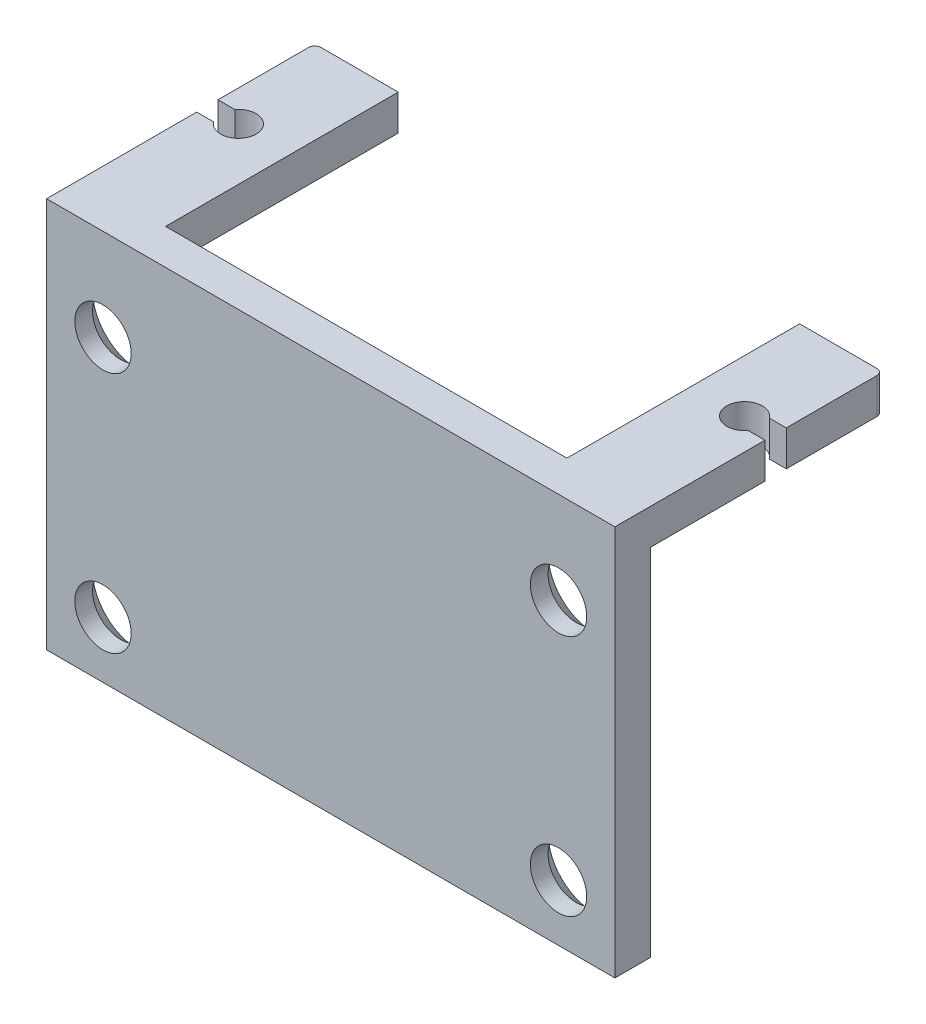
ISO-10303-21;
HEADER;
FILE_DESCRIPTION(('STEP AP214'),'2;1');
FILE_NAME('part.step','',(''),(''),'','','');
FILE_SCHEMA(('AUTOMOTIVE_DESIGN { 1 0 10303 214 1 1 1 1 }'));
ENDSEC;
DATA;
#1=APPLICATION_CONTEXT('core data for automotive mechanical design processes');
#2=APPLICATION_PROTOCOL_DEFINITION('international standard','automotive_design',2000,#1);
#3=PRODUCT_CONTEXT('',#1,'mechanical');
#4=PRODUCT('Part','Part','',(#3));
#5=PRODUCT_RELATED_PRODUCT_CATEGORY('part','',(#4));
#6=PRODUCT_DEFINITION_FORMATION('','',#4);
#7=PRODUCT_DEFINITION_CONTEXT('part definition',#1,'design');
#8=PRODUCT_DEFINITION('design','',#6,#7);
#9=PRODUCT_DEFINITION_SHAPE('','',#8);
#10=(LENGTH_UNIT() NAMED_UNIT(*) SI_UNIT(.MILLI.,.METRE.));
#11=(NAMED_UNIT(*) PLANE_ANGLE_UNIT() SI_UNIT($,.RADIAN.));
#12=(NAMED_UNIT(*) SI_UNIT($,.STERADIAN.) SOLID_ANGLE_UNIT());
#13=UNCERTAINTY_MEASURE_WITH_UNIT(LENGTH_MEASURE(1.E-05),#10,'distance_accuracy_value','');
#14=(GEOMETRIC_REPRESENTATION_CONTEXT(3) GLOBAL_UNCERTAINTY_ASSIGNED_CONTEXT((#13)) GLOBAL_UNIT_ASSIGNED_CONTEXT((#10,
#11,#12)) REPRESENTATION_CONTEXT('',''));
#15=CARTESIAN_POINT('',(0.,0.,0.));
#16=DIRECTION('',(0.,0.,1.));
#17=DIRECTION('',(1.,0.,0.));
#18=AXIS2_PLACEMENT_3D('',#15,#16,#17);
#19=CARTESIAN_POINT('',(-16.15,12.0772170092383,-0.6));
#20=DIRECTION('',(0.,0.,-1.));
#21=DIRECTION('',(-1.,0.,0.));
#22=AXIS2_PLACEMENT_3D('',#19,#20,#21);
#23=PLANE('',#22);
#24=DIRECTION('',(0.,-1.,0.));
#25=VECTOR('',#24,1.);
#26=CARTESIAN_POINT('',(-16.,20.2,-0.6));
#27=LINE('',#26,#25);
#28=CARTESIAN_POINT('',(-16.,20.2,-0.6));
#29=VERTEX_POINT('',#28);
#30=CARTESIAN_POINT('',(-16.,18.2,-0.6));
#31=VERTEX_POINT('',#30);
#32=EDGE_CURVE('E325',#29,#31,#27,.T.);
#33=ORIENTED_EDGE('',*,*,#32,.T.);
#34=DIRECTION('',(1.,0.,0.));
#35=VECTOR('',#34,1.);
#36=CARTESIAN_POINT('',(-16.15,18.2,-0.6));
#37=LINE('',#36,#35);
#38=CARTESIAN_POINT('',(-15.05,18.2,-0.6));
#39=VERTEX_POINT('',#38);
#40=EDGE_CURVE('E300',#31,#39,#37,.T.);
#41=ORIENTED_EDGE('',*,*,#40,.T.);
#42=DIRECTION('',(0.,1.,0.));
#43=VECTOR('',#42,1.);
#44=CARTESIAN_POINT('',(-15.05,12.0772170092383,-0.6));
#45=LINE('',#44,#43);
#46=CARTESIAN_POINT('',(-15.05,20.2,-0.6));
#47=VERTEX_POINT('',#46);
#48=EDGE_CURVE('E59',#39,#47,#45,.T.);
#49=ORIENTED_EDGE('',*,*,#48,.T.);
#50=DIRECTION('',(1.,0.,0.));
#51=VECTOR('',#50,1.);
#52=CARTESIAN_POINT('',(-16.,20.2,-0.6));
#53=LINE('',#52,#51);
#54=EDGE_CURVE('E323',#29,#47,#53,.T.);
#55=ORIENTED_EDGE('',*,*,#54,.F.);
#56=EDGE_LOOP('',(#33,#41,#49,#55));
#57=FACE_BOUND('',#56,.T.);
#58=ADVANCED_FACE('F43',(#57),#23,.F.);
#59=CARTESIAN_POINT('',(-14.25,12.0772170092383,0.));
#60=DIRECTION('',(0.,1.,0.));
#61=DIRECTION('',(0.,0.,1.));
#62=AXIS2_PLACEMENT_3D('',#59,#60,#61);
#63=CYLINDRICAL_SURFACE('',#62,1.);
#64=ORIENTED_EDGE('',*,*,#48,.F.);
#65=CARTESIAN_POINT('',(-14.25,18.2,0.));
#66=DIRECTION('',(0.,1.,0.));
#67=DIRECTION('',(0.,0.,1.));
#68=AXIS2_PLACEMENT_3D('',#65,#66,#67);
#69=CIRCLE('',#68,1.);
#70=CARTESIAN_POINT('',(-15.05,18.2,0.6));
#71=VERTEX_POINT('',#70);
#72=EDGE_CURVE('E302',#39,#71,#69,.F.);
#73=ORIENTED_EDGE('',*,*,#72,.T.);
#74=DIRECTION('',(0.,1.,0.));
#75=VECTOR('',#74,1.);
#76=CARTESIAN_POINT('',(-15.05,12.0772170092383,0.6));
#77=LINE('',#76,#75);
#78=CARTESIAN_POINT('',(-15.05,20.2,0.6));
#79=VERTEX_POINT('',#78);
#80=EDGE_CURVE('E340',#71,#79,#77,.T.);
#81=ORIENTED_EDGE('',*,*,#80,.T.);
#82=CARTESIAN_POINT('',(-14.25,20.2,0.));
#83=DIRECTION('',(0.,-1.,0.));
#84=DIRECTION('',(0.,0.,1.));
#85=AXIS2_PLACEMENT_3D('',#82,#83,#84);
#86=CIRCLE('',#85,1.);
#87=EDGE_CURVE('E308',#47,#79,#86,.T.);
#88=ORIENTED_EDGE('',*,*,#87,.F.);
#89=EDGE_LOOP('',(#64,#73,#81,#88));
#90=FACE_BOUND('',#89,.T.);
#91=ADVANCED_FACE('F397',(#90),#63,.F.);
#92=CARTESIAN_POINT('',(-16.15,12.0772170092383,0.6));
#93=DIRECTION('',(0.,0.,1.));
#94=DIRECTION('',(1.,0.,0.));
#95=AXIS2_PLACEMENT_3D('',#92,#93,#94);
#96=PLANE('',#95);
#97=ORIENTED_EDGE('',*,*,#80,.F.);
#98=DIRECTION('',(-1.,0.,0.));
#99=VECTOR('',#98,1.);
#100=CARTESIAN_POINT('',(-16.15,18.2,0.6));
#101=LINE('',#100,#99);
#102=CARTESIAN_POINT('',(-16.,18.2,0.6));
#103=VERTEX_POINT('',#102);
#104=EDGE_CURVE('E305',#71,#103,#101,.T.);
#105=ORIENTED_EDGE('',*,*,#104,.T.);
#106=DIRECTION('',(0.,-1.,0.));
#107=VECTOR('',#106,1.);
#108=CARTESIAN_POINT('',(-16.,20.2,0.6));
#109=LINE('',#108,#107);
#110=CARTESIAN_POINT('',(-16.,20.2,0.6));
#111=VERTEX_POINT('',#110);
#112=EDGE_CURVE('E337',#111,#103,#109,.T.);
#113=ORIENTED_EDGE('',*,*,#112,.F.);
#114=DIRECTION('',(-1.,0.,0.));
#115=VECTOR('',#114,1.);
#116=CARTESIAN_POINT('',(-15.05,20.2,0.6));
#117=LINE('',#116,#115);
#118=EDGE_CURVE('E311',#79,#111,#117,.T.);
#119=ORIENTED_EDGE('',*,*,#118,.F.);
#120=EDGE_LOOP('',(#97,#105,#113,#119));
#121=FACE_BOUND('',#120,.T.);
#122=ADVANCED_FACE('F402',(#121),#96,.F.);
#123=CARTESIAN_POINT('',(-11.3,16.6,-6.05));
#124=DIRECTION('',(-1.,0.,0.));
#125=DIRECTION('',(0.,0.,1.));
#126=AXIS2_PLACEMENT_3D('',#123,#124,#125);
#127=PLANE('',#126);
#128=DIRECTION('',(0.,0.,-1.));
#129=VECTOR('',#128,1.);
#130=CARTESIAN_POINT('',(-11.3,20.2,6.05));
#131=LINE('',#130,#129);
#132=CARTESIAN_POINT('',(-11.3,20.2,7.05));
#133=VERTEX_POINT('',#132);
#134=CARTESIAN_POINT('',(-11.3,20.2,-6.05));
#135=VERTEX_POINT('',#134);
#136=EDGE_CURVE('E315',#133,#135,#131,.T.);
#137=ORIENTED_EDGE('',*,*,#136,.F.);
#138=DIRECTION('',(0.,1.,0.));
#139=VECTOR('',#138,1.);
#140=CARTESIAN_POINT('',(-11.3,18.2,7.05));
#141=LINE('',#140,#139);
#142=CARTESIAN_POINT('',(-11.3,18.2,7.05));
#143=VERTEX_POINT('',#142);
#144=EDGE_CURVE('E214',#143,#133,#141,.T.);
#145=ORIENTED_EDGE('',*,*,#144,.F.);
#146=DIRECTION('',(0.,0.,-1.));
#147=VECTOR('',#146,1.);
#148=CARTESIAN_POINT('',(-11.3,18.2,-6.05));
#149=LINE('',#148,#147);
#150=CARTESIAN_POINT('',(-11.3,18.2,-6.05));
#151=VERTEX_POINT('',#150);
#152=EDGE_CURVE('E295',#143,#151,#149,.T.);
#153=ORIENTED_EDGE('',*,*,#152,.T.);
#154=DIRECTION('',(0.,-1.,0.));
#155=VECTOR('',#154,1.);
#156=CARTESIAN_POINT('',(-11.3,20.2,-6.05));
#157=LINE('',#156,#155);
#158=EDGE_CURVE('E334',#135,#151,#157,.T.);
#159=ORIENTED_EDGE('',*,*,#158,.F.);
#160=EDGE_LOOP('',(#137,#145,#153,#159));
#161=FACE_BOUND('',#160,.T.);
#162=ADVANCED_FACE('F406',(#161),#127,.F.);
#163=CARTESIAN_POINT('',(-16.,20.2,0.6));
#164=DIRECTION('',(1.,0.,0.));
#165=DIRECTION('',(0.,0.,-1.));
#166=AXIS2_PLACEMENT_3D('',#163,#164,#165);
#167=PLANE('',#166);
#168=DIRECTION('',(0.,0.,1.));
#169=VECTOR('',#168,1.);
#170=CARTESIAN_POINT('',(-16.,18.2,5.7));
#171=LINE('',#170,#169);
#172=CARTESIAN_POINT('',(-16.,18.2,7.05));
#173=VERTEX_POINT('',#172);
#174=EDGE_CURVE('E352',#103,#173,#171,.T.);
#175=ORIENTED_EDGE('',*,*,#174,.T.);
#176=DIRECTION('',(0.,1.,0.));
#177=VECTOR('',#176,1.);
#178=CARTESIAN_POINT('',(-16.,-1.8,7.05));
#179=LINE('',#178,#177);
#180=CARTESIAN_POINT('',(-16.,-1.8,7.05));
#181=VERTEX_POINT('',#180);
#182=EDGE_CURVE('E208',#181,#173,#179,.T.);
#183=ORIENTED_EDGE('',*,*,#182,.F.);
#184=DIRECTION('',(0.,0.,1.));
#185=VECTOR('',#184,1.);
#186=CARTESIAN_POINT('',(-16.,-1.8,6.05));
#187=LINE('',#186,#185);
#188=CARTESIAN_POINT('',(-16.,-1.8,9.05));
#189=VERTEX_POINT('',#188);
#190=EDGE_CURVE('E280',#181,#189,#187,.T.);
#191=ORIENTED_EDGE('',*,*,#190,.T.);
#192=DIRECTION('',(0.,1.,0.));
#193=VECTOR('',#192,1.);
#194=CARTESIAN_POINT('',(-16.,-1.8,9.05));
#195=LINE('',#194,#193);
#196=CARTESIAN_POINT('',(-16.,20.2,9.05));
#197=VERTEX_POINT('',#196);
#198=EDGE_CURVE('E289',#189,#197,#195,.T.);
#199=ORIENTED_EDGE('',*,*,#198,.T.);
#200=DIRECTION('',(0.,0.,1.));
#201=VECTOR('',#200,1.);
#202=CARTESIAN_POINT('',(-16.,20.2,0.6));
#203=LINE('',#202,#201);
#204=EDGE_CURVE('E313',#111,#197,#203,.T.);
#205=ORIENTED_EDGE('',*,*,#204,.F.);
#206=ORIENTED_EDGE('',*,*,#112,.T.);
#207=EDGE_LOOP('',(#175,#183,#191,#199,#205,#206));
#208=FACE_BOUND('',#207,.T.);
#209=ADVANCED_FACE('F451',(#208),#167,.F.);
#210=CARTESIAN_POINT('',(-11.3,20.2,-6.05));
#211=DIRECTION('',(0.,0.,1.));
#212=DIRECTION('',(1.,0.,0.));
#213=AXIS2_PLACEMENT_3D('',#210,#211,#212);
#214=PLANE('',#213);
#215=DIRECTION('',(-1.,0.,0.));
#216=VECTOR('',#215,1.);
#217=CARTESIAN_POINT('',(-15.65,18.2,-6.05));
#218=LINE('',#217,#216);
#219=CARTESIAN_POINT('',(-15.65,18.2,-6.05));
#220=VERTEX_POINT('',#219);
#221=EDGE_CURVE('E342',#151,#220,#218,.T.);
#222=ORIENTED_EDGE('',*,*,#221,.T.);
#223=DIRECTION('',(0.,-1.,0.));
#224=VECTOR('',#223,1.);
#225=CARTESIAN_POINT('',(-15.65,20.2,-6.05));
#226=LINE('',#225,#224);
#227=CARTESIAN_POINT('',(-15.65,20.2,-6.05));
#228=VERTEX_POINT('',#227);
#229=EDGE_CURVE('E331',#228,#220,#226,.T.);
#230=ORIENTED_EDGE('',*,*,#229,.F.);
#231=DIRECTION('',(-1.,0.,0.));
#232=VECTOR('',#231,1.);
#233=CARTESIAN_POINT('',(-11.3,20.2,-6.05));
#234=LINE('',#233,#232);
#235=EDGE_CURVE('E317',#135,#228,#234,.T.);
#236=ORIENTED_EDGE('',*,*,#235,.F.);
#237=ORIENTED_EDGE('',*,*,#158,.T.);
#238=EDGE_LOOP('',(#222,#230,#236,#237));
#239=FACE_BOUND('',#238,.T.);
#240=ADVANCED_FACE('F487',(#239),#214,.F.);
#241=CARTESIAN_POINT('',(-15.65,20.2,-5.7));
#242=DIRECTION('',(0.,-1.,0.));
#243=DIRECTION('',(0.,0.,-1.));
#244=AXIS2_PLACEMENT_3D('',#241,#242,#243);
#245=CYLINDRICAL_SURFACE('',#244,0.35);
#246=CARTESIAN_POINT('',(-15.65,18.2,-5.7));
#247=DIRECTION('',(0.,1.,0.));
#248=DIRECTION('',(0.,0.,1.));
#249=AXIS2_PLACEMENT_3D('',#246,#247,#248);
#250=CIRCLE('',#249,0.35);
#251=CARTESIAN_POINT('',(-16.,18.2,-5.7));
#252=VERTEX_POINT('',#251);
#253=EDGE_CURVE('E346',#220,#252,#250,.T.);
#254=ORIENTED_EDGE('',*,*,#253,.T.);
#255=DIRECTION('',(0.,-1.,0.));
#256=VECTOR('',#255,1.);
#257=CARTESIAN_POINT('',(-16.,20.2,-5.7));
#258=LINE('',#257,#256);
#259=CARTESIAN_POINT('',(-16.,20.2,-5.7));
#260=VERTEX_POINT('',#259);
#261=EDGE_CURVE('E328',#260,#252,#258,.T.);
#262=ORIENTED_EDGE('',*,*,#261,.F.);
#263=CARTESIAN_POINT('',(-15.65,20.2,-5.7));
#264=DIRECTION('',(0.,1.,0.));
#265=DIRECTION('',(0.,0.,1.));
#266=AXIS2_PLACEMENT_3D('',#263,#264,#265);
#267=CIRCLE('',#266,0.35);
#268=EDGE_CURVE('E319',#228,#260,#267,.T.);
#269=ORIENTED_EDGE('',*,*,#268,.F.);
#270=ORIENTED_EDGE('',*,*,#229,.T.);
#271=EDGE_LOOP('',(#254,#262,#269,#270));
#272=FACE_BOUND('',#271,.T.);
#273=ADVANCED_FACE('F491',(#272),#245,.T.);
#274=CARTESIAN_POINT('',(-16.,20.2,-5.7));
#275=DIRECTION('',(1.,0.,0.));
#276=DIRECTION('',(0.,0.,-1.));
#277=AXIS2_PLACEMENT_3D('',#274,#275,#276);
#278=PLANE('',#277);
#279=DIRECTION('',(0.,0.,1.));
#280=VECTOR('',#279,1.);
#281=CARTESIAN_POINT('',(-16.,18.2,-0.6));
#282=LINE('',#281,#280);
#283=EDGE_CURVE('E349',#252,#31,#282,.T.);
#284=ORIENTED_EDGE('',*,*,#283,.T.);
#285=ORIENTED_EDGE('',*,*,#32,.F.);
#286=DIRECTION('',(0.,0.,1.));
#287=VECTOR('',#286,1.);
#288=CARTESIAN_POINT('',(-16.,20.2,-5.7));
#289=LINE('',#288,#287);
#290=EDGE_CURVE('E321',#260,#29,#289,.T.);
#291=ORIENTED_EDGE('',*,*,#290,.F.);
#292=ORIENTED_EDGE('',*,*,#261,.T.);
#293=EDGE_LOOP('',(#284,#285,#291,#292));
#294=FACE_BOUND('',#293,.T.);
#295=ADVANCED_FACE('F496',(#294),#278,.F.);
#296=CARTESIAN_POINT('',(-14.25,20.2,0.));
#297=DIRECTION('',(0.,1.,0.));
#298=DIRECTION('',(0.,0.,1.));
#299=AXIS2_PLACEMENT_3D('',#296,#297,#298);
#300=PLANE('',#299);
#301=DIRECTION('',(0.,0.,1.));
#302=VECTOR('',#301,1.);
#303=CARTESIAN_POINT('',(11.3,20.2,-6.05));
#304=LINE('',#303,#302);
#305=CARTESIAN_POINT('',(11.3,20.2,-6.05));
#306=VERTEX_POINT('',#305);
#307=CARTESIAN_POINT('',(11.3,20.2,7.05));
#308=VERTEX_POINT('',#307);
#309=EDGE_CURVE('E239',#306,#308,#304,.T.);
#310=ORIENTED_EDGE('',*,*,#309,.T.);
#311=DIRECTION('',(1.,0.,0.));
#312=VECTOR('',#311,1.);
#313=CARTESIAN_POINT('',(-11.3,20.2,7.05));
#314=LINE('',#313,#312);
#315=EDGE_CURVE('E202',#133,#308,#314,.T.);
#316=ORIENTED_EDGE('',*,*,#315,.F.);
#317=ORIENTED_EDGE('',*,*,#136,.T.);
#318=ORIENTED_EDGE('',*,*,#235,.T.);
#319=ORIENTED_EDGE('',*,*,#268,.T.);
#320=ORIENTED_EDGE('',*,*,#290,.T.);
#321=ORIENTED_EDGE('',*,*,#54,.T.);
#322=ORIENTED_EDGE('',*,*,#87,.T.);
#323=ORIENTED_EDGE('',*,*,#118,.T.);
#324=ORIENTED_EDGE('',*,*,#204,.T.);
#325=DIRECTION('',(1.,0.,0.));
#326=VECTOR('',#325,1.);
#327=CARTESIAN_POINT('',(-16.,20.2,9.05));
#328=LINE('',#327,#326);
#329=CARTESIAN_POINT('',(16.,20.2,9.05));
#330=VERTEX_POINT('',#329);
#331=EDGE_CURVE('E277',#197,#330,#328,.T.);
#332=ORIENTED_EDGE('',*,*,#331,.T.);
#333=DIRECTION('',(0.,0.,-1.));
#334=VECTOR('',#333,1.);
#335=CARTESIAN_POINT('',(16.,20.2,6.05));
#336=LINE('',#335,#334);
#337=CARTESIAN_POINT('',(16.,20.2,0.599999999999996));
#338=VERTEX_POINT('',#337);
#339=EDGE_CURVE('E283',#330,#338,#336,.T.);
#340=ORIENTED_EDGE('',*,*,#339,.T.);
#341=DIRECTION('',(-1.,0.,0.));
#342=VECTOR('',#341,1.);
#343=CARTESIAN_POINT('',(16.,20.2,0.599999999999996));
#344=LINE('',#343,#342);
#345=CARTESIAN_POINT('',(15.05,20.2,0.599999999999995));
#346=VERTEX_POINT('',#345);
#347=EDGE_CURVE('E241',#338,#346,#344,.T.);
#348=ORIENTED_EDGE('',*,*,#347,.T.);
#349=CARTESIAN_POINT('',(14.25,20.2,0.));
#350=DIRECTION('',(0.,-1.,0.));
#351=DIRECTION('',(0.,0.,1.));
#352=AXIS2_PLACEMENT_3D('',#349,#350,#351);
#353=CIRCLE('',#352,0.999999999999997);
#354=CARTESIAN_POINT('',(15.05,20.2,-0.599999999999998));
#355=VERTEX_POINT('',#354);
#356=EDGE_CURVE('E244',#346,#355,#353,.T.);
#357=ORIENTED_EDGE('',*,*,#356,.T.);
#358=DIRECTION('',(1.,0.,0.));
#359=VECTOR('',#358,1.);
#360=CARTESIAN_POINT('',(15.05,20.2,-0.599999999999997));
#361=LINE('',#360,#359);
#362=CARTESIAN_POINT('',(16.,20.2,-0.599999999999996));
#363=VERTEX_POINT('',#362);
#364=EDGE_CURVE('E247',#355,#363,#361,.T.);
#365=ORIENTED_EDGE('',*,*,#364,.T.);
#366=DIRECTION('',(0.,0.,-1.));
#367=VECTOR('',#366,1.);
#368=CARTESIAN_POINT('',(16.,20.2,-0.599999999999996));
#369=LINE('',#368,#367);
#370=CARTESIAN_POINT('',(16.,20.2,-5.7));
#371=VERTEX_POINT('',#370);
#372=EDGE_CURVE('E249',#363,#371,#369,.T.);
#373=ORIENTED_EDGE('',*,*,#372,.T.);
#374=CARTESIAN_POINT('',(15.65,20.2,-5.7));
#375=DIRECTION('',(0.,1.,0.));
#376=DIRECTION('',(0.,0.,1.));
#377=AXIS2_PLACEMENT_3D('',#374,#375,#376);
#378=CIRCLE('',#377,0.35);
#379=CARTESIAN_POINT('',(15.65,20.2,-6.05));
#380=VERTEX_POINT('',#379);
#381=EDGE_CURVE('E251',#371,#380,#378,.T.);
#382=ORIENTED_EDGE('',*,*,#381,.T.);
#383=DIRECTION('',(-1.,0.,0.));
#384=VECTOR('',#383,1.);
#385=CARTESIAN_POINT('',(15.65,20.2,-6.05));
#386=LINE('',#385,#384);
#387=EDGE_CURVE('E236',#380,#306,#386,.T.);
#388=ORIENTED_EDGE('',*,*,#387,.T.);
#389=EDGE_LOOP('',(#310,#316,#317,#318,#319,#320,#321,#322,#323,#324,#332,#340,#348,#357,#365,
#373,#382,#388));
#390=FACE_BOUND('',#389,.T.);
#391=ADVANCED_FACE('F445',(#390),#300,.T.);
#392=CARTESIAN_POINT('',(0.,18.2,0.));
#393=DIRECTION('',(0.,1.,0.));
#394=DIRECTION('',(0.,0.,1.));
#395=AXIS2_PLACEMENT_3D('',#392,#393,#394);
#396=PLANE('',#395);
#397=ORIENTED_EDGE('',*,*,#152,.F.);
#398=DIRECTION('',(1.,0.,0.));
#399=VECTOR('',#398,1.);
#400=CARTESIAN_POINT('',(-16.,18.2,7.05));
#401=LINE('',#400,#399);
#402=EDGE_CURVE('E211',#173,#143,#401,.T.);
#403=ORIENTED_EDGE('',*,*,#402,.F.);
#404=ORIENTED_EDGE('',*,*,#174,.F.);
#405=ORIENTED_EDGE('',*,*,#104,.F.);
#406=ORIENTED_EDGE('',*,*,#72,.F.);
#407=ORIENTED_EDGE('',*,*,#40,.F.);
#408=ORIENTED_EDGE('',*,*,#283,.F.);
#409=ORIENTED_EDGE('',*,*,#253,.F.);
#410=ORIENTED_EDGE('',*,*,#221,.F.);
#411=EDGE_LOOP('',(#397,#403,#404,#405,#406,#407,#408,#409,#410));
#412=FACE_BOUND('',#411,.T.);
#413=ADVANCED_FACE('F499',(#412),#396,.F.);
#414=CARTESIAN_POINT('',(16.,-1.8,6.05));
#415=DIRECTION('',(1.,0.,0.));
#416=DIRECTION('',(0.,0.,-1.));
#417=AXIS2_PLACEMENT_3D('',#414,#415,#416);
#418=PLANE('',#417);
#419=DIRECTION('',(0.,-1.,0.));
#420=VECTOR('',#419,1.);
#421=CARTESIAN_POINT('',(16.,18.2,7.05));
#422=LINE('',#421,#420);
#423=CARTESIAN_POINT('',(16.,18.2,7.05));
#424=VERTEX_POINT('',#423);
#425=CARTESIAN_POINT('',(16.,-1.8,7.05));
#426=VERTEX_POINT('',#425);
#427=EDGE_CURVE('E197',#424,#426,#422,.T.);
#428=ORIENTED_EDGE('',*,*,#427,.F.);
#429=DIRECTION('',(0.,0.,-1.));
#430=VECTOR('',#429,1.);
#431=CARTESIAN_POINT('',(16.,18.2,0.599999999999996));
#432=LINE('',#431,#430);
#433=CARTESIAN_POINT('',(16.,18.2,0.599999999999996));
#434=VERTEX_POINT('',#433);
#435=EDGE_CURVE('E194',#424,#434,#432,.T.);
#436=ORIENTED_EDGE('',*,*,#435,.T.);
#437=DIRECTION('',(0.,-1.,0.));
#438=VECTOR('',#437,1.);
#439=CARTESIAN_POINT('',(16.,20.2,0.599999999999996));
#440=LINE('',#439,#438);
#441=EDGE_CURVE('E262',#338,#434,#440,.T.);
#442=ORIENTED_EDGE('',*,*,#441,.F.);
#443=ORIENTED_EDGE('',*,*,#339,.F.);
#444=DIRECTION('',(0.,1.,0.));
#445=VECTOR('',#444,1.);
#446=CARTESIAN_POINT('',(16.,-1.8,9.05));
#447=LINE('',#446,#445);
#448=CARTESIAN_POINT('',(16.,-1.8,9.05));
#449=VERTEX_POINT('',#448);
#450=EDGE_CURVE('E293',#449,#330,#447,.T.);
#451=ORIENTED_EDGE('',*,*,#450,.F.);
#452=DIRECTION('',(0.,0.,-1.));
#453=VECTOR('',#452,1.);
#454=CARTESIAN_POINT('',(16.,-1.8,6.05));
#455=LINE('',#454,#453);
#456=EDGE_CURVE('E286',#449,#426,#455,.T.);
#457=ORIENTED_EDGE('',*,*,#456,.T.);
#458=EDGE_LOOP('',(#428,#436,#442,#443,#451,#457));
#459=FACE_BOUND('',#458,.T.);
#460=ADVANCED_FACE('F435',(#459),#418,.T.);
#461=CARTESIAN_POINT('',(-16.,-1.8,9.05));
#462=DIRECTION('',(0.,0.,1.));
#463=DIRECTION('',(1.,0.,0.));
#464=AXIS2_PLACEMENT_3D('',#461,#462,#463);
#465=PLANE('',#464);
#466=CARTESIAN_POINT('',(12.825,15.025,9.05));
#467=DIRECTION('',(0.,0.,-1.));
#468=DIRECTION('',(1.,0.,0.));
#469=AXIS2_PLACEMENT_3D('',#466,#467,#468);
#470=CIRCLE('',#469,1.5875);
#471=CARTESIAN_POINT('',(14.4125,15.025,9.05));
#472=VERTEX_POINT('',#471);
#473=EDGE_CURVE('E217',#472,#472,#470,.T.);
#474=ORIENTED_EDGE('',*,*,#473,.T.);
#475=EDGE_LOOP('',(#474));
#476=FACE_BOUND('',#475,.T.);
#477=CARTESIAN_POINT('',(-12.825,15.025,9.05));
#478=DIRECTION('',(0.,0.,-1.));
#479=DIRECTION('',(-1.,0.,0.));
#480=AXIS2_PLACEMENT_3D('',#477,#478,#479);
#481=CIRCLE('',#480,1.5875);
#482=CARTESIAN_POINT('',(-14.4125,15.025,9.05));
#483=VERTEX_POINT('',#482);
#484=EDGE_CURVE('E221',#483,#483,#481,.T.);
#485=ORIENTED_EDGE('',*,*,#484,.T.);
#486=EDGE_LOOP('',(#485));
#487=FACE_BOUND('',#486,.T.);
#488=CARTESIAN_POINT('',(-12.825,1.375,9.05));
#489=DIRECTION('',(0.,0.,-1.));
#490=DIRECTION('',(1.,0.,0.));
#491=AXIS2_PLACEMENT_3D('',#488,#489,#490);
#492=CIRCLE('',#491,1.5875);
#493=CARTESIAN_POINT('',(-11.2375,1.375,9.05));
#494=VERTEX_POINT('',#493);
#495=EDGE_CURVE('E218',#494,#494,#492,.T.);
#496=ORIENTED_EDGE('',*,*,#495,.T.);
#497=EDGE_LOOP('',(#496));
#498=FACE_BOUND('',#497,.T.);
#499=CARTESIAN_POINT('',(12.825,1.375,9.05));
#500=DIRECTION('',(0.,0.,-1.));
#501=DIRECTION('',(-1.,0.,0.));
#502=AXIS2_PLACEMENT_3D('',#499,#500,#501);
#503=CIRCLE('',#502,1.5875);
#504=CARTESIAN_POINT('',(11.2375,1.375,9.05));
#505=VERTEX_POINT('',#504);
#506=EDGE_CURVE('E188',#505,#505,#503,.T.);
#507=ORIENTED_EDGE('',*,*,#506,.T.);
#508=EDGE_LOOP('',(#507));
#509=FACE_BOUND('',#508,.T.);
#510=ORIENTED_EDGE('',*,*,#331,.F.);
#511=ORIENTED_EDGE('',*,*,#198,.F.);
#512=DIRECTION('',(1.,0.,0.));
#513=VECTOR('',#512,1.);
#514=CARTESIAN_POINT('',(-16.,-1.8,9.05));
#515=LINE('',#514,#513);
#516=EDGE_CURVE('E282',#189,#449,#515,.T.);
#517=ORIENTED_EDGE('',*,*,#516,.T.);
#518=ORIENTED_EDGE('',*,*,#450,.T.);
#519=EDGE_LOOP('',(#510,#511,#517,#518));
#520=FACE_BOUND('',#519,.T.);
#521=ADVANCED_FACE('F431',(#476,#487,#498,#509,#520),#465,.T.);
#522=CARTESIAN_POINT('',(0.,-1.8,0.));
#523=DIRECTION('',(0.,1.,0.));
#524=DIRECTION('',(0.,0.,1.));
#525=AXIS2_PLACEMENT_3D('',#522,#523,#524);
#526=PLANE('',#525);
#527=ORIENTED_EDGE('',*,*,#190,.F.);
#528=DIRECTION('',(-1.,0.,0.));
#529=VECTOR('',#528,1.);
#530=CARTESIAN_POINT('',(16.,-1.8,7.05));
#531=LINE('',#530,#529);
#532=EDGE_CURVE('E206',#426,#181,#531,.T.);
#533=ORIENTED_EDGE('',*,*,#532,.F.);
#534=ORIENTED_EDGE('',*,*,#456,.F.);
#535=ORIENTED_EDGE('',*,*,#516,.F.);
#536=EDGE_LOOP('',(#527,#533,#534,#535));
#537=FACE_BOUND('',#536,.T.);
#538=ADVANCED_FACE('F434',(#537),#526,.F.);
#539=CARTESIAN_POINT('',(16.15,12.0772170092383,0.599999999999996));
#540=DIRECTION('',(0.,0.,1.));
#541=DIRECTION('',(1.,0.,0.));
#542=AXIS2_PLACEMENT_3D('',#539,#540,#541);
#543=PLANE('',#542);
#544=ORIENTED_EDGE('',*,*,#441,.T.);
#545=DIRECTION('',(-1.,0.,0.));
#546=VECTOR('',#545,1.);
#547=CARTESIAN_POINT('',(16.15,18.2,0.599999999999996));
#548=LINE('',#547,#546);
#549=CARTESIAN_POINT('',(15.05,18.2,0.599999999999996));
#550=VERTEX_POINT('',#549);
#551=EDGE_CURVE('E187',#434,#550,#548,.T.);
#552=ORIENTED_EDGE('',*,*,#551,.T.);
#553=DIRECTION('',(0.,1.,0.));
#554=VECTOR('',#553,1.);
#555=CARTESIAN_POINT('',(15.05,12.0772170092383,0.599999999999995));
#556=LINE('',#555,#554);
#557=EDGE_CURVE('E266',#550,#346,#556,.T.);
#558=ORIENTED_EDGE('',*,*,#557,.T.);
#559=ORIENTED_EDGE('',*,*,#347,.F.);
#560=EDGE_LOOP('',(#544,#552,#558,#559));
#561=FACE_BOUND('',#560,.T.);
#562=ADVANCED_FACE('F460',(#561),#543,.F.);
#563=CARTESIAN_POINT('',(14.25,12.0772170092383,0.));
#564=DIRECTION('',(0.,1.,0.));
#565=DIRECTION('',(0.,0.,1.));
#566=AXIS2_PLACEMENT_3D('',#563,#564,#565);
#567=CYLINDRICAL_SURFACE('',#566,0.999999999999998);
#568=ORIENTED_EDGE('',*,*,#557,.F.);
#569=CARTESIAN_POINT('',(14.25,18.2,0.));
#570=DIRECTION('',(0.,1.,0.));
#571=DIRECTION('',(0.,0.,1.));
#572=AXIS2_PLACEMENT_3D('',#569,#570,#571);
#573=CIRCLE('',#572,0.999999999999998);
#574=CARTESIAN_POINT('',(15.05,18.2,-0.599999999999998));
#575=VERTEX_POINT('',#574);
#576=EDGE_CURVE('E230',#550,#575,#573,.F.);
#577=ORIENTED_EDGE('',*,*,#576,.T.);
#578=DIRECTION('',(0.,1.,0.));
#579=VECTOR('',#578,1.);
#580=CARTESIAN_POINT('',(15.05,12.0772170092383,-0.599999999999996));
#581=LINE('',#580,#579);
#582=EDGE_CURVE('E269',#575,#355,#581,.T.);
#583=ORIENTED_EDGE('',*,*,#582,.T.);
#584=ORIENTED_EDGE('',*,*,#356,.F.);
#585=EDGE_LOOP('',(#568,#577,#583,#584));
#586=FACE_BOUND('',#585,.T.);
#587=ADVANCED_FACE('F465',(#586),#567,.F.);
#588=CARTESIAN_POINT('',(16.15,12.0772170092383,-0.599999999999996));
#589=DIRECTION('',(0.,0.,-1.));
#590=DIRECTION('',(-1.,0.,0.));
#591=AXIS2_PLACEMENT_3D('',#588,#589,#590);
#592=PLANE('',#591);
#593=ORIENTED_EDGE('',*,*,#582,.F.);
#594=DIRECTION('',(1.,0.,0.));
#595=VECTOR('',#594,1.);
#596=CARTESIAN_POINT('',(16.15,18.2,-0.599999999999996));
#597=LINE('',#596,#595);
#598=CARTESIAN_POINT('',(16.,18.2,-0.599999999999996));
#599=VERTEX_POINT('',#598);
#600=EDGE_CURVE('E233',#575,#599,#597,.T.);
#601=ORIENTED_EDGE('',*,*,#600,.T.);
#602=DIRECTION('',(0.,-1.,0.));
#603=VECTOR('',#602,1.);
#604=CARTESIAN_POINT('',(16.,20.2,-0.599999999999996));
#605=LINE('',#604,#603);
#606=EDGE_CURVE('E259',#363,#599,#605,.T.);
#607=ORIENTED_EDGE('',*,*,#606,.F.);
#608=ORIENTED_EDGE('',*,*,#364,.F.);
#609=EDGE_LOOP('',(#593,#601,#607,#608));
#610=FACE_BOUND('',#609,.T.);
#611=ADVANCED_FACE('F468',(#610),#592,.F.);
#612=CARTESIAN_POINT('',(11.3,16.6,6.05));
#613=DIRECTION('',(1.,0.,0.));
#614=DIRECTION('',(0.,0.,-1.));
#615=AXIS2_PLACEMENT_3D('',#612,#613,#614);
#616=PLANE('',#615);
#617=DIRECTION('',(0.,-1.,0.));
#618=VECTOR('',#617,1.);
#619=CARTESIAN_POINT('',(11.3,20.2,-6.05));
#620=LINE('',#619,#618);
#621=CARTESIAN_POINT('',(11.3,18.2,-6.05));
#622=VERTEX_POINT('',#621);
#623=EDGE_CURVE('E184',#306,#622,#620,.T.);
#624=ORIENTED_EDGE('',*,*,#623,.T.);
#625=DIRECTION('',(0.,0.,1.));
#626=VECTOR('',#625,1.);
#627=CARTESIAN_POINT('',(11.3,18.2,6.05));
#628=LINE('',#627,#626);
#629=CARTESIAN_POINT('',(11.3,18.2,7.05));
#630=VERTEX_POINT('',#629);
#631=EDGE_CURVE('E177',#622,#630,#628,.T.);
#632=ORIENTED_EDGE('',*,*,#631,.T.);
#633=DIRECTION('',(0.,-1.,0.));
#634=VECTOR('',#633,1.);
#635=CARTESIAN_POINT('',(11.3,20.2,7.05));
#636=LINE('',#635,#634);
#637=EDGE_CURVE('E181',#308,#630,#636,.T.);
#638=ORIENTED_EDGE('',*,*,#637,.F.);
#639=ORIENTED_EDGE('',*,*,#309,.F.);
#640=EDGE_LOOP('',(#624,#632,#638,#639));
#641=FACE_BOUND('',#640,.T.);
#642=ADVANCED_FACE('F179',(#641),#616,.F.);
#643=CARTESIAN_POINT('',(15.65,20.2,-6.05));
#644=DIRECTION('',(0.,0.,1.));
#645=DIRECTION('',(1.,0.,0.));
#646=AXIS2_PLACEMENT_3D('',#643,#644,#645);
#647=PLANE('',#646);
#648=DIRECTION('',(-1.,0.,0.));
#649=VECTOR('',#648,1.);
#650=CARTESIAN_POINT('',(11.3,18.2,-6.05));
#651=LINE('',#650,#649);
#652=CARTESIAN_POINT('',(15.65,18.2,-6.05));
#653=VERTEX_POINT('',#652);
#654=EDGE_CURVE('E275',#653,#622,#651,.T.);
#655=ORIENTED_EDGE('',*,*,#654,.T.);
#656=ORIENTED_EDGE('',*,*,#623,.F.);
#657=ORIENTED_EDGE('',*,*,#387,.F.);
#658=DIRECTION('',(0.,-1.,0.));
#659=VECTOR('',#658,1.);
#660=CARTESIAN_POINT('',(15.65,20.2,-6.05));
#661=LINE('',#660,#659);
#662=EDGE_CURVE('E253',#380,#653,#661,.T.);
#663=ORIENTED_EDGE('',*,*,#662,.T.);
#664=EDGE_LOOP('',(#655,#656,#657,#663));
#665=FACE_BOUND('',#664,.T.);
#666=ADVANCED_FACE('F480',(#665),#647,.F.);
#667=CARTESIAN_POINT('',(16.,20.2,-0.599999999999996));
#668=DIRECTION('',(-1.,0.,0.));
#669=DIRECTION('',(0.,0.,1.));
#670=AXIS2_PLACEMENT_3D('',#667,#668,#669);
#671=PLANE('',#670);
#672=DIRECTION('',(0.,0.,-1.));
#673=VECTOR('',#672,1.);
#674=CARTESIAN_POINT('',(16.,18.2,-5.7));
#675=LINE('',#674,#673);
#676=CARTESIAN_POINT('',(16.,18.2,-5.7));
#677=VERTEX_POINT('',#676);
#678=EDGE_CURVE('E268',#599,#677,#675,.T.);
#679=ORIENTED_EDGE('',*,*,#678,.T.);
#680=DIRECTION('',(0.,-1.,0.));
#681=VECTOR('',#680,1.);
#682=CARTESIAN_POINT('',(16.,20.2,-5.7));
#683=LINE('',#682,#681);
#684=EDGE_CURVE('E256',#371,#677,#683,.T.);
#685=ORIENTED_EDGE('',*,*,#684,.F.);
#686=ORIENTED_EDGE('',*,*,#372,.F.);
#687=ORIENTED_EDGE('',*,*,#606,.T.);
#688=EDGE_LOOP('',(#679,#685,#686,#687));
#689=FACE_BOUND('',#688,.T.);
#690=ADVANCED_FACE('F475',(#689),#671,.F.);
#691=CARTESIAN_POINT('',(15.65,20.2,-5.7));
#692=DIRECTION('',(0.,-1.,0.));
#693=DIRECTION('',(0.,0.,-1.));
#694=AXIS2_PLACEMENT_3D('',#691,#692,#693);
#695=CYLINDRICAL_SURFACE('',#694,0.35);
#696=CARTESIAN_POINT('',(15.65,18.2,-5.7));
#697=DIRECTION('',(0.,1.,0.));
#698=DIRECTION('',(0.,0.,1.));
#699=AXIS2_PLACEMENT_3D('',#696,#697,#698);
#700=CIRCLE('',#699,0.35);
#701=EDGE_CURVE('E272',#677,#653,#700,.T.);
#702=ORIENTED_EDGE('',*,*,#701,.T.);
#703=ORIENTED_EDGE('',*,*,#662,.F.);
#704=ORIENTED_EDGE('',*,*,#381,.F.);
#705=ORIENTED_EDGE('',*,*,#684,.T.);
#706=EDGE_LOOP('',(#702,#703,#704,#705));
#707=FACE_BOUND('',#706,.T.);
#708=ADVANCED_FACE('F477',(#707),#695,.T.);
#709=CARTESIAN_POINT('',(0.,18.2,0.));
#710=DIRECTION('',(0.,1.,0.));
#711=DIRECTION('',(0.,0.,1.));
#712=AXIS2_PLACEMENT_3D('',#709,#710,#711);
#713=PLANE('',#712);
#714=ORIENTED_EDGE('',*,*,#435,.F.);
#715=DIRECTION('',(1.,0.,0.));
#716=VECTOR('',#715,1.);
#717=CARTESIAN_POINT('',(11.3,18.2,7.05));
#718=LINE('',#717,#716);
#719=EDGE_CURVE('E191',#630,#424,#718,.T.);
#720=ORIENTED_EDGE('',*,*,#719,.F.);
#721=ORIENTED_EDGE('',*,*,#631,.F.);
#722=ORIENTED_EDGE('',*,*,#654,.F.);
#723=ORIENTED_EDGE('',*,*,#701,.F.);
#724=ORIENTED_EDGE('',*,*,#678,.F.);
#725=ORIENTED_EDGE('',*,*,#600,.F.);
#726=ORIENTED_EDGE('',*,*,#576,.F.);
#727=ORIENTED_EDGE('',*,*,#551,.F.);
#728=EDGE_LOOP('',(#714,#720,#721,#722,#723,#724,#725,#726,#727));
#729=FACE_BOUND('',#728,.T.);
#730=ADVANCED_FACE('F192',(#729),#713,.F.);
#731=CARTESIAN_POINT('',(12.825,1.375,9.05));
#732=DIRECTION('',(0.,0.,-1.));
#733=DIRECTION('',(-1.,0.,0.));
#734=AXIS2_PLACEMENT_3D('',#731,#732,#733);
#735=CYLINDRICAL_SURFACE('',#734,1.5875);
#736=CARTESIAN_POINT('',(12.825,1.375,8.05000000000001));
#737=DIRECTION('',(0.,0.,1.));
#738=DIRECTION('',(1.,0.,0.));
#739=AXIS2_PLACEMENT_3D('',#736,#737,#738);
#740=CIRCLE('',#739,1.5875);
#741=CARTESIAN_POINT('',(14.4125,1.375,8.05000000000001));
#742=VERTEX_POINT('',#741);
#743=EDGE_CURVE('E52',#742,#742,#740,.F.);
#744=ORIENTED_EDGE('',*,*,#743,.T.);
#745=EDGE_LOOP('',(#744));
#746=FACE_BOUND('',#745,.T.);
#747=ORIENTED_EDGE('',*,*,#506,.F.);
#748=EDGE_LOOP('',(#747));
#749=FACE_BOUND('',#748,.T.);
#750=ADVANCED_FACE('F374',(#746,#749),#735,.F.);
#751=CARTESIAN_POINT('',(-12.825,1.375,9.05));
#752=DIRECTION('',(0.,0.,-1.));
#753=DIRECTION('',(-1.,0.,0.));
#754=AXIS2_PLACEMENT_3D('',#751,#752,#753);
#755=CYLINDRICAL_SURFACE('',#754,1.5875);
#756=CARTESIAN_POINT('',(-12.825,1.375,8.05000000000001));
#757=DIRECTION('',(0.,0.,1.));
#758=DIRECTION('',(1.,0.,0.));
#759=AXIS2_PLACEMENT_3D('',#756,#757,#758);
#760=CIRCLE('',#759,1.5875);
#761=CARTESIAN_POINT('',(-11.2375,1.375,8.05000000000001));
#762=VERTEX_POINT('',#761);
#763=EDGE_CURVE('E369',#762,#762,#760,.F.);
#764=ORIENTED_EDGE('',*,*,#763,.T.);
#765=EDGE_LOOP('',(#764));
#766=FACE_BOUND('',#765,.T.);
#767=ORIENTED_EDGE('',*,*,#495,.F.);
#768=EDGE_LOOP('',(#767));
#769=FACE_BOUND('',#768,.T.);
#770=ADVANCED_FACE('F424',(#766,#769),#755,.F.);
#771=CARTESIAN_POINT('',(-12.825,15.025,9.05));
#772=DIRECTION('',(0.,0.,-1.));
#773=DIRECTION('',(-1.,0.,0.));
#774=AXIS2_PLACEMENT_3D('',#771,#772,#773);
#775=CYLINDRICAL_SURFACE('',#774,1.5875);
#776=CARTESIAN_POINT('',(-12.825,15.025,8.05));
#777=DIRECTION('',(0.,0.,1.));
#778=DIRECTION('',(1.,0.,0.));
#779=AXIS2_PLACEMENT_3D('',#776,#777,#778);
#780=CIRCLE('',#779,1.5875);
#781=CARTESIAN_POINT('',(-11.2375,15.025,8.05));
#782=VERTEX_POINT('',#781);
#783=EDGE_CURVE('E366',#782,#782,#780,.F.);
#784=ORIENTED_EDGE('',*,*,#783,.T.);
#785=EDGE_LOOP('',(#784));
#786=FACE_BOUND('',#785,.T.);
#787=ORIENTED_EDGE('',*,*,#484,.F.);
#788=EDGE_LOOP('',(#787));
#789=FACE_BOUND('',#788,.T.);
#790=ADVANCED_FACE('F427',(#786,#789),#775,.F.);
#791=CARTESIAN_POINT('',(12.825,15.025,9.05));
#792=DIRECTION('',(0.,0.,-1.));
#793=DIRECTION('',(-1.,0.,0.));
#794=AXIS2_PLACEMENT_3D('',#791,#792,#793);
#795=CYLINDRICAL_SURFACE('',#794,1.5875);
#796=CARTESIAN_POINT('',(12.825,15.025,8.05));
#797=DIRECTION('',(0.,0.,1.));
#798=DIRECTION('',(1.,0.,0.));
#799=AXIS2_PLACEMENT_3D('',#796,#797,#798);
#800=CIRCLE('',#799,1.5875);
#801=CARTESIAN_POINT('',(14.4125,15.025,8.05));
#802=VERTEX_POINT('',#801);
#803=EDGE_CURVE('E11',#802,#802,#800,.F.);
#804=ORIENTED_EDGE('',*,*,#803,.T.);
#805=EDGE_LOOP('',(#804));
#806=FACE_BOUND('',#805,.T.);
#807=ORIENTED_EDGE('',*,*,#473,.F.);
#808=EDGE_LOOP('',(#807));
#809=FACE_BOUND('',#808,.T.);
#810=ADVANCED_FACE('F386',(#806,#809),#795,.F.);
#811=CARTESIAN_POINT('',(0.,0.,7.05));
#812=DIRECTION('',(0.,0.,1.));
#813=DIRECTION('',(1.,0.,0.));
#814=AXIS2_PLACEMENT_3D('',#811,#812,#813);
#815=PLANE('',#814);
#816=CARTESIAN_POINT('',(-12.825,15.025,7.05));
#817=DIRECTION('',(0.,0.,1.));
#818=DIRECTION('',(1.,0.,0.));
#819=AXIS2_PLACEMENT_3D('',#816,#817,#818);
#820=CIRCLE('',#819,2.5875);
#821=CARTESIAN_POINT('',(-10.2375,15.025,7.05));
#822=VERTEX_POINT('',#821);
#823=EDGE_CURVE('E363',#822,#822,#820,.T.);
#824=ORIENTED_EDGE('',*,*,#823,.T.);
#825=EDGE_LOOP('',(#824));
#826=FACE_BOUND('',#825,.T.);
#827=CARTESIAN_POINT('',(-12.825,1.375,7.05));
#828=DIRECTION('',(0.,0.,1.));
#829=DIRECTION('',(1.,0.,0.));
#830=AXIS2_PLACEMENT_3D('',#827,#828,#829);
#831=CIRCLE('',#830,2.58750000000001);
#832=CARTESIAN_POINT('',(-10.2375,1.375,7.05));
#833=VERTEX_POINT('',#832);
#834=EDGE_CURVE('E360',#833,#833,#831,.T.);
#835=ORIENTED_EDGE('',*,*,#834,.T.);
#836=EDGE_LOOP('',(#835));
#837=FACE_BOUND('',#836,.T.);
#838=CARTESIAN_POINT('',(12.825,1.375,7.05));
#839=DIRECTION('',(0.,0.,1.));
#840=DIRECTION('',(1.,0.,0.));
#841=AXIS2_PLACEMENT_3D('',#838,#839,#840);
#842=CIRCLE('',#841,2.58750000000001);
#843=CARTESIAN_POINT('',(15.4125,1.375,7.05));
#844=VERTEX_POINT('',#843);
#845=EDGE_CURVE('E357',#844,#844,#842,.T.);
#846=ORIENTED_EDGE('',*,*,#845,.T.);
#847=EDGE_LOOP('',(#846));
#848=FACE_BOUND('',#847,.T.);
#849=CARTESIAN_POINT('',(12.825,15.025,7.05));
#850=DIRECTION('',(0.,0.,1.));
#851=DIRECTION('',(1.,0.,0.));
#852=AXIS2_PLACEMENT_3D('',#849,#850,#851);
#853=CIRCLE('',#852,2.5875);
#854=CARTESIAN_POINT('',(15.4125,15.025,7.05));
#855=VERTEX_POINT('',#854);
#856=EDGE_CURVE('E354',#855,#855,#853,.T.);
#857=ORIENTED_EDGE('',*,*,#856,.T.);
#858=EDGE_LOOP('',(#857));
#859=FACE_BOUND('',#858,.T.);
#860=ORIENTED_EDGE('',*,*,#637,.T.);
#861=ORIENTED_EDGE('',*,*,#719,.T.);
#862=ORIENTED_EDGE('',*,*,#427,.T.);
#863=ORIENTED_EDGE('',*,*,#532,.T.);
#864=ORIENTED_EDGE('',*,*,#182,.T.);
#865=ORIENTED_EDGE('',*,*,#402,.T.);
#866=ORIENTED_EDGE('',*,*,#144,.T.);
#867=ORIENTED_EDGE('',*,*,#315,.T.);
#868=EDGE_LOOP('',(#860,#861,#862,#863,#864,#865,#866,#867));
#869=FACE_BOUND('',#868,.T.);
#870=ADVANCED_FACE('F199',(#826,#837,#848,#859,#869),#815,.F.);
#871=CARTESIAN_POINT('',(-12.825,15.025,7.05));
#872=DIRECTION('',(0.,0.,-1.));
#873=DIRECTION('',(-1.,0.,0.));
#874=AXIS2_PLACEMENT_3D('',#871,#872,#873);
#875=CONICAL_SURFACE('',#874,2.5875,0.785398163397446);
#876=ORIENTED_EDGE('',*,*,#783,.F.);
#877=EDGE_LOOP('',(#876));
#878=FACE_BOUND('',#877,.T.);
#879=ORIENTED_EDGE('',*,*,#823,.F.);
#880=EDGE_LOOP('',(#879));
#881=FACE_BOUND('',#880,.T.);
#882=ADVANCED_FACE('F385',(#878,#881),#875,.F.);
#883=CARTESIAN_POINT('',(-12.825,1.375,7.05));
#884=DIRECTION('',(0.,0.,-1.));
#885=DIRECTION('',(-1.,0.,0.));
#886=AXIS2_PLACEMENT_3D('',#883,#884,#885);
#887=CONICAL_SURFACE('',#886,2.58750000000001,0.785398163397448);
#888=ORIENTED_EDGE('',*,*,#763,.F.);
#889=EDGE_LOOP('',(#888));
#890=FACE_BOUND('',#889,.T.);
#891=ORIENTED_EDGE('',*,*,#834,.F.);
#892=EDGE_LOOP('',(#891));
#893=FACE_BOUND('',#892,.T.);
#894=ADVANCED_FACE('F380',(#890,#893),#887,.F.);
#895=CARTESIAN_POINT('',(12.825,1.375,7.05));
#896=DIRECTION('',(0.,0.,-1.));
#897=DIRECTION('',(-1.,0.,0.));
#898=AXIS2_PLACEMENT_3D('',#895,#896,#897);
#899=CONICAL_SURFACE('',#898,2.58750000000001,0.785398163397448);
#900=ORIENTED_EDGE('',*,*,#743,.F.);
#901=EDGE_LOOP('',(#900));
#902=FACE_BOUND('',#901,.T.);
#903=ORIENTED_EDGE('',*,*,#845,.F.);
#904=EDGE_LOOP('',(#903));
#905=FACE_BOUND('',#904,.T.);
#906=ADVANCED_FACE('F377',(#902,#905),#899,.F.);
#907=CARTESIAN_POINT('',(12.825,15.025,7.05));
#908=DIRECTION('',(0.,0.,-1.));
#909=DIRECTION('',(-1.,0.,0.));
#910=AXIS2_PLACEMENT_3D('',#907,#908,#909);
#911=CONICAL_SURFACE('',#910,2.5875,0.785398163397446);
#912=ORIENTED_EDGE('',*,*,#803,.F.);
#913=EDGE_LOOP('',(#912));
#914=FACE_BOUND('',#913,.T.);
#915=ORIENTED_EDGE('',*,*,#856,.F.);
#916=EDGE_LOOP('',(#915));
#917=FACE_BOUND('',#916,.T.);
#918=ADVANCED_FACE('F45',(#914,#917),#911,.F.);
#919=CLOSED_SHELL('',(#58,#91,#122,#162,#209,#240,#273,#295,#391,#413,#460,#521,#538,#562,#587,
#611,#642,#666,#690,#708,#730,#750,#770,#790,#810,#870,#882,#894,#906,#918));
#920=MANIFOLD_SOLID_BREP('B2',#919);
#921=ADVANCED_BREP_SHAPE_REPRESENTATION('',(#18,#920),#14);
#922=SHAPE_DEFINITION_REPRESENTATION(#9,#921);
ENDSEC;
END-ISO-10303-21;
